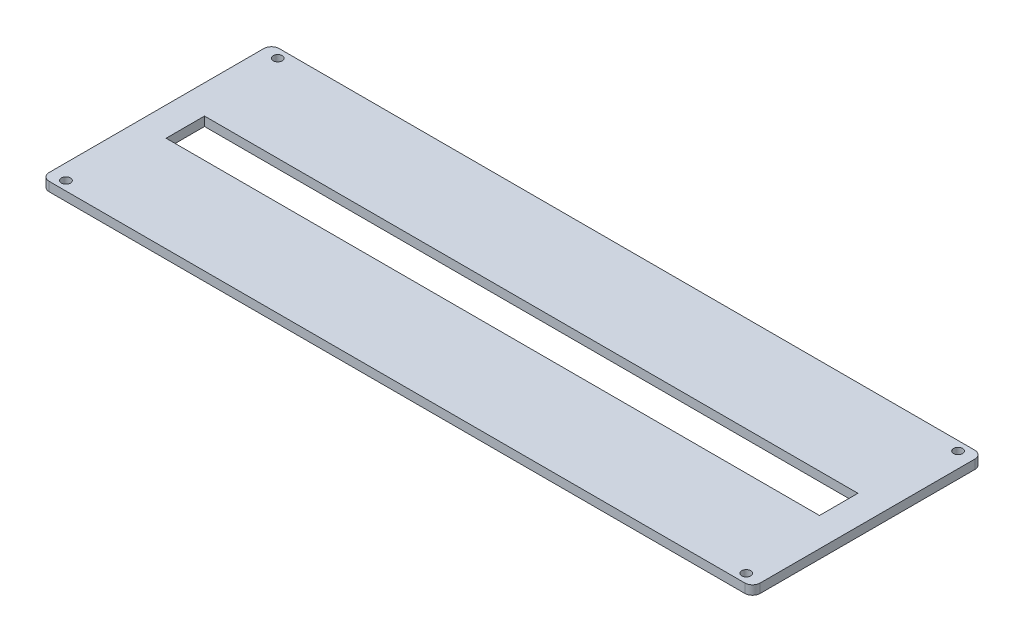
ISO-10303-21;
HEADER;
FILE_DESCRIPTION(('STEP AP214'),'2;1');
FILE_NAME('part.step','',(''),(''),'','','');
FILE_SCHEMA(('AUTOMOTIVE_DESIGN { 1 0 10303 214 1 1 1 1 }'));
ENDSEC;
DATA;
#1=APPLICATION_CONTEXT('core data for automotive mechanical design processes');
#2=APPLICATION_PROTOCOL_DEFINITION('international standard','automotive_design',2000,#1);
#3=PRODUCT_CONTEXT('',#1,'mechanical');
#4=PRODUCT('Part','Part','',(#3));
#5=PRODUCT_RELATED_PRODUCT_CATEGORY('part','',(#4));
#6=PRODUCT_DEFINITION_FORMATION('','',#4);
#7=PRODUCT_DEFINITION_CONTEXT('part definition',#1,'design');
#8=PRODUCT_DEFINITION('design','',#6,#7);
#9=PRODUCT_DEFINITION_SHAPE('','',#8);
#10=(LENGTH_UNIT() NAMED_UNIT(*) SI_UNIT(.MILLI.,.METRE.));
#11=(NAMED_UNIT(*) PLANE_ANGLE_UNIT() SI_UNIT($,.RADIAN.));
#12=(NAMED_UNIT(*) SI_UNIT($,.STERADIAN.) SOLID_ANGLE_UNIT());
#13=UNCERTAINTY_MEASURE_WITH_UNIT(LENGTH_MEASURE(1.E-05),#10,'distance_accuracy_value','');
#14=(GEOMETRIC_REPRESENTATION_CONTEXT(3) GLOBAL_UNCERTAINTY_ASSIGNED_CONTEXT((#13)) GLOBAL_UNIT_ASSIGNED_CONTEXT((#10,
#11,#12)) REPRESENTATION_CONTEXT('',''));
#15=CARTESIAN_POINT('',(0.,0.,0.));
#16=DIRECTION('',(0.,0.,1.));
#17=DIRECTION('',(1.,0.,0.));
#18=AXIS2_PLACEMENT_3D('',#15,#16,#17);
#19=CARTESIAN_POINT('',(0.,3.,0.));
#20=DIRECTION('',(0.,1.,0.));
#21=DIRECTION('',(0.,0.,1.));
#22=AXIS2_PLACEMENT_3D('',#19,#20,#21);
#23=PLANE('',#22);
#24=CARTESIAN_POINT('',(-5.08,3.,73.));
#25=DIRECTION('',(0.,1.,0.));
#26=DIRECTION('',(0.,0.,1.));
#27=AXIS2_PLACEMENT_3D('',#24,#25,#26);
#28=CIRCLE('',#27,1.5);
#29=CARTESIAN_POINT('',(-5.08,3.,74.5));
#30=VERTEX_POINT('',#29);
#31=EDGE_CURVE('E162',#30,#30,#28,.F.);
#32=ORIENTED_EDGE('',*,*,#31,.T.);
#33=EDGE_LOOP('',(#32));
#34=FACE_BOUND('',#33,.T.);
#35=CARTESIAN_POINT('',(-5.08,3.,3.00000000000004));
#36=DIRECTION('',(0.,1.,0.));
#37=DIRECTION('',(0.,0.,1.));
#38=AXIS2_PLACEMENT_3D('',#35,#36,#37);
#39=CIRCLE('',#38,1.5);
#40=CARTESIAN_POINT('',(-5.08,3.,4.50000000000004));
#41=VERTEX_POINT('',#40);
#42=EDGE_CURVE('E165',#41,#41,#39,.T.);
#43=ORIENTED_EDGE('',*,*,#42,.F.);
#44=EDGE_LOOP('',(#43));
#45=FACE_BOUND('',#44,.T.);
#46=DIRECTION('',(-1.,0.,0.));
#47=VECTOR('',#46,1.);
#48=CARTESIAN_POINT('',(0.,3.,76.));
#49=LINE('',#48,#47);
#50=CARTESIAN_POINT('',(-2.54,3.,76.));
#51=VERTEX_POINT('',#50);
#52=CARTESIAN_POINT('',(-232.41,3.,76.));
#53=VERTEX_POINT('',#52);
#54=EDGE_CURVE('E172',#51,#53,#49,.T.);
#55=ORIENTED_EDGE('',*,*,#54,.F.);
#56=CARTESIAN_POINT('',(-2.54,3.,73.46));
#57=DIRECTION('',(0.,1.,0.));
#58=DIRECTION('',(0.,0.,1.));
#59=AXIS2_PLACEMENT_3D('',#56,#57,#58);
#60=CIRCLE('',#59,2.54);
#61=CARTESIAN_POINT('',(0.,3.,73.46));
#62=VERTEX_POINT('',#61);
#63=EDGE_CURVE('E238',#51,#62,#60,.T.);
#64=ORIENTED_EDGE('',*,*,#63,.T.);
#65=DIRECTION('',(0.,0.,-1.));
#66=VECTOR('',#65,1.);
#67=CARTESIAN_POINT('',(0.,3.,0.));
#68=LINE('',#67,#66);
#69=CARTESIAN_POINT('',(0.,3.,2.54));
#70=VERTEX_POINT('',#69);
#71=EDGE_CURVE('E175',#62,#70,#68,.T.);
#72=ORIENTED_EDGE('',*,*,#71,.T.);
#73=CARTESIAN_POINT('',(-2.54,3.,2.54));
#74=DIRECTION('',(0.,1.,0.));
#75=DIRECTION('',(0.,0.,1.));
#76=AXIS2_PLACEMENT_3D('',#73,#74,#75);
#77=CIRCLE('',#76,2.54);
#78=CARTESIAN_POINT('',(-2.54,3.,0.));
#79=VERTEX_POINT('',#78);
#80=EDGE_CURVE('E59',#70,#79,#77,.T.);
#81=ORIENTED_EDGE('',*,*,#80,.T.);
#82=DIRECTION('',(-1.,0.,0.));
#83=VECTOR('',#82,1.);
#84=CARTESIAN_POINT('',(0.,3.,0.));
#85=LINE('',#84,#83);
#86=CARTESIAN_POINT('',(-232.41,3.,0.));
#87=VERTEX_POINT('',#86);
#88=EDGE_CURVE('E177',#79,#87,#85,.T.);
#89=ORIENTED_EDGE('',*,*,#88,.T.);
#90=CARTESIAN_POINT('',(-232.41,3.,2.54000000000001));
#91=DIRECTION('',(0.,1.,0.));
#92=DIRECTION('',(0.,0.,1.));
#93=AXIS2_PLACEMENT_3D('',#90,#91,#92);
#94=CIRCLE('',#93,2.54);
#95=CARTESIAN_POINT('',(-234.95,3.,2.54000000000001));
#96=VERTEX_POINT('',#95);
#97=EDGE_CURVE('E235',#87,#96,#94,.T.);
#98=ORIENTED_EDGE('',*,*,#97,.T.);
#99=DIRECTION('',(0.,0.,-1.));
#100=VECTOR('',#99,1.);
#101=CARTESIAN_POINT('',(-234.95,3.,0.));
#102=LINE('',#101,#100);
#103=CARTESIAN_POINT('',(-234.95,3.,73.46));
#104=VERTEX_POINT('',#103);
#105=EDGE_CURVE('E169',#104,#96,#102,.T.);
#106=ORIENTED_EDGE('',*,*,#105,.F.);
#107=CARTESIAN_POINT('',(-232.41,3.,73.46));
#108=DIRECTION('',(0.,1.,0.));
#109=DIRECTION('',(0.,0.,1.));
#110=AXIS2_PLACEMENT_3D('',#107,#108,#109);
#111=CIRCLE('',#110,2.54);
#112=EDGE_CURVE('E233',#104,#53,#111,.T.);
#113=ORIENTED_EDGE('',*,*,#112,.T.);
#114=EDGE_LOOP('',(#55,#64,#72,#81,#89,#98,#106,#113));
#115=FACE_BOUND('',#114,.T.);
#116=CARTESIAN_POINT('',(-229.87,3.,73.));
#117=DIRECTION('',(0.,1.,0.));
#118=DIRECTION('',(0.,0.,1.));
#119=AXIS2_PLACEMENT_3D('',#116,#117,#118);
#120=CIRCLE('',#119,1.5);
#121=CARTESIAN_POINT('',(-229.87,3.,74.5));
#122=VERTEX_POINT('',#121);
#123=EDGE_CURVE('E179',#122,#122,#120,.T.);
#124=ORIENTED_EDGE('',*,*,#123,.F.);
#125=EDGE_LOOP('',(#124));
#126=FACE_BOUND('',#125,.T.);
#127=CARTESIAN_POINT('',(-229.87,3.,3.00000000000004));
#128=DIRECTION('',(0.,1.,0.));
#129=DIRECTION('',(0.,0.,1.));
#130=AXIS2_PLACEMENT_3D('',#127,#128,#129);
#131=CIRCLE('',#130,1.5);
#132=CARTESIAN_POINT('',(-229.87,3.,4.50000000000004));
#133=VERTEX_POINT('',#132);
#134=EDGE_CURVE('E182',#133,#133,#131,.F.);
#135=ORIENTED_EDGE('',*,*,#134,.T.);
#136=EDGE_LOOP('',(#135));
#137=FACE_BOUND('',#136,.T.);
#138=DIRECTION('',(-1.,0.,0.));
#139=VECTOR('',#138,1.);
#140=CARTESIAN_POINT('',(-9.52500000000001,3.,31.65));
#141=LINE('',#140,#139);
#142=CARTESIAN_POINT('',(-9.52500000000001,3.,31.65));
#143=VERTEX_POINT('',#142);
#144=CARTESIAN_POINT('',(-225.425,3.,31.65));
#145=VERTEX_POINT('',#144);
#146=EDGE_CURVE('E152',#143,#145,#141,.T.);
#147=ORIENTED_EDGE('',*,*,#146,.F.);
#148=DIRECTION('',(0.,0.,1.));
#149=VECTOR('',#148,1.);
#150=CARTESIAN_POINT('',(-9.52500000000001,3.,31.65));
#151=LINE('',#150,#149);
#152=CARTESIAN_POINT('',(-9.52500000000001,3.,44.35));
#153=VERTEX_POINT('',#152);
#154=EDGE_CURVE('E132',#143,#153,#151,.T.);
#155=ORIENTED_EDGE('',*,*,#154,.T.);
#156=DIRECTION('',(-1.,0.,0.));
#157=VECTOR('',#156,1.);
#158=CARTESIAN_POINT('',(-9.52500000000001,3.,44.35));
#159=LINE('',#158,#157);
#160=CARTESIAN_POINT('',(-225.425,3.,44.35));
#161=VERTEX_POINT('',#160);
#162=EDGE_CURVE('E142',#153,#161,#159,.T.);
#163=ORIENTED_EDGE('',*,*,#162,.T.);
#164=DIRECTION('',(0.,0.,1.));
#165=VECTOR('',#164,1.);
#166=CARTESIAN_POINT('',(-225.425,3.,31.65));
#167=LINE('',#166,#165);
#168=EDGE_CURVE('E148',#145,#161,#167,.T.);
#169=ORIENTED_EDGE('',*,*,#168,.F.);
#170=EDGE_LOOP('',(#147,#155,#163,#169));
#171=FACE_BOUND('',#170,.T.);
#172=ADVANCED_FACE('F37',(#34,#45,#115,#126,#137,#171),#23,.T.);
#173=CARTESIAN_POINT('',(0.,0.,0.));
#174=DIRECTION('',(0.,1.,0.));
#175=DIRECTION('',(0.,0.,1.));
#176=AXIS2_PLACEMENT_3D('',#173,#174,#175);
#177=PLANE('',#176);
#178=CARTESIAN_POINT('',(-229.87,0.,3.00000000000004));
#179=DIRECTION('',(0.,1.,0.));
#180=DIRECTION('',(0.,0.,1.));
#181=AXIS2_PLACEMENT_3D('',#178,#179,#180);
#182=CIRCLE('',#181,1.5);
#183=CARTESIAN_POINT('',(-229.87,0.,4.50000000000004));
#184=VERTEX_POINT('',#183);
#185=EDGE_CURVE('E166',#184,#184,#182,.F.);
#186=ORIENTED_EDGE('',*,*,#185,.F.);
#187=EDGE_LOOP('',(#186));
#188=FACE_BOUND('',#187,.T.);
#189=CARTESIAN_POINT('',(-229.87,0.,73.));
#190=DIRECTION('',(0.,1.,0.));
#191=DIRECTION('',(0.,0.,1.));
#192=AXIS2_PLACEMENT_3D('',#189,#190,#191);
#193=CIRCLE('',#192,1.5);
#194=CARTESIAN_POINT('',(-229.87,0.,74.5));
#195=VERTEX_POINT('',#194);
#196=EDGE_CURVE('E202',#195,#195,#193,.T.);
#197=ORIENTED_EDGE('',*,*,#196,.T.);
#198=EDGE_LOOP('',(#197));
#199=FACE_BOUND('',#198,.T.);
#200=DIRECTION('',(0.,0.,-1.));
#201=VECTOR('',#200,1.);
#202=CARTESIAN_POINT('',(0.,0.,0.));
#203=LINE('',#202,#201);
#204=CARTESIAN_POINT('',(0.,0.,73.46));
#205=VERTEX_POINT('',#204);
#206=CARTESIAN_POINT('',(0.,0.,2.54));
#207=VERTEX_POINT('',#206);
#208=EDGE_CURVE('E197',#205,#207,#203,.T.);
#209=ORIENTED_EDGE('',*,*,#208,.F.);
#210=CARTESIAN_POINT('',(-2.54,0.,73.46));
#211=DIRECTION('',(0.,1.,0.));
#212=DIRECTION('',(0.,0.,1.));
#213=AXIS2_PLACEMENT_3D('',#210,#211,#212);
#214=CIRCLE('',#213,2.54);
#215=CARTESIAN_POINT('',(-2.54,0.,76.));
#216=VERTEX_POINT('',#215);
#217=EDGE_CURVE('E226',#205,#216,#214,.F.);
#218=ORIENTED_EDGE('',*,*,#217,.T.);
#219=DIRECTION('',(-1.,0.,0.));
#220=VECTOR('',#219,1.);
#221=CARTESIAN_POINT('',(0.,0.,76.));
#222=LINE('',#221,#220);
#223=CARTESIAN_POINT('',(-232.41,0.,76.));
#224=VERTEX_POINT('',#223);
#225=EDGE_CURVE('E194',#216,#224,#222,.T.);
#226=ORIENTED_EDGE('',*,*,#225,.T.);
#227=CARTESIAN_POINT('',(-232.41,0.,73.46));
#228=DIRECTION('',(0.,1.,0.));
#229=DIRECTION('',(0.,0.,1.));
#230=AXIS2_PLACEMENT_3D('',#227,#228,#229);
#231=CIRCLE('',#230,2.54);
#232=CARTESIAN_POINT('',(-234.95,0.,73.46));
#233=VERTEX_POINT('',#232);
#234=EDGE_CURVE('E220',#224,#233,#231,.F.);
#235=ORIENTED_EDGE('',*,*,#234,.T.);
#236=DIRECTION('',(0.,0.,-1.));
#237=VECTOR('',#236,1.);
#238=CARTESIAN_POINT('',(-234.95,0.,0.));
#239=LINE('',#238,#237);
#240=CARTESIAN_POINT('',(-234.95,0.,2.54000000000001));
#241=VERTEX_POINT('',#240);
#242=EDGE_CURVE('E191',#233,#241,#239,.T.);
#243=ORIENTED_EDGE('',*,*,#242,.T.);
#244=CARTESIAN_POINT('',(-232.41,0.,2.54000000000001));
#245=DIRECTION('',(0.,1.,0.));
#246=DIRECTION('',(0.,0.,1.));
#247=AXIS2_PLACEMENT_3D('',#244,#245,#246);
#248=CIRCLE('',#247,2.54);
#249=CARTESIAN_POINT('',(-232.41,0.,0.));
#250=VERTEX_POINT('',#249);
#251=EDGE_CURVE('E222',#241,#250,#248,.F.);
#252=ORIENTED_EDGE('',*,*,#251,.T.);
#253=DIRECTION('',(-1.,0.,0.));
#254=VECTOR('',#253,1.);
#255=CARTESIAN_POINT('',(0.,0.,0.));
#256=LINE('',#255,#254);
#257=CARTESIAN_POINT('',(-2.54,0.,0.));
#258=VERTEX_POINT('',#257);
#259=EDGE_CURVE('E200',#258,#250,#256,.T.);
#260=ORIENTED_EDGE('',*,*,#259,.F.);
#261=CARTESIAN_POINT('',(-2.54,0.,2.54));
#262=DIRECTION('',(0.,1.,0.));
#263=DIRECTION('',(0.,0.,1.));
#264=AXIS2_PLACEMENT_3D('',#261,#262,#263);
#265=CIRCLE('',#264,2.54);
#266=EDGE_CURVE('E224',#258,#207,#265,.F.);
#267=ORIENTED_EDGE('',*,*,#266,.T.);
#268=EDGE_LOOP('',(#209,#218,#226,#235,#243,#252,#260,#267));
#269=FACE_BOUND('',#268,.T.);
#270=CARTESIAN_POINT('',(-5.08,0.,3.00000000000004));
#271=DIRECTION('',(0.,1.,0.));
#272=DIRECTION('',(0.,0.,1.));
#273=AXIS2_PLACEMENT_3D('',#270,#271,#272);
#274=CIRCLE('',#273,1.5);
#275=CARTESIAN_POINT('',(-5.08,0.,4.50000000000004));
#276=VERTEX_POINT('',#275);
#277=EDGE_CURVE('E188',#276,#276,#274,.T.);
#278=ORIENTED_EDGE('',*,*,#277,.T.);
#279=EDGE_LOOP('',(#278));
#280=FACE_BOUND('',#279,.T.);
#281=CARTESIAN_POINT('',(-5.08,0.,73.));
#282=DIRECTION('',(0.,1.,0.));
#283=DIRECTION('',(0.,0.,1.));
#284=AXIS2_PLACEMENT_3D('',#281,#282,#283);
#285=CIRCLE('',#284,1.5);
#286=CARTESIAN_POINT('',(-5.08,0.,74.5));
#287=VERTEX_POINT('',#286);
#288=EDGE_CURVE('E138',#287,#287,#285,.F.);
#289=ORIENTED_EDGE('',*,*,#288,.F.);
#290=EDGE_LOOP('',(#289));
#291=FACE_BOUND('',#290,.T.);
#292=DIRECTION('',(0.,0.,1.));
#293=VECTOR('',#292,1.);
#294=CARTESIAN_POINT('',(-9.52500000000001,0.,0.));
#295=LINE('',#294,#293);
#296=CARTESIAN_POINT('',(-9.52500000000001,0.,31.65));
#297=VERTEX_POINT('',#296);
#298=CARTESIAN_POINT('',(-9.52500000000001,0.,44.35));
#299=VERTEX_POINT('',#298);
#300=EDGE_CURVE('E135',#297,#299,#295,.T.);
#301=ORIENTED_EDGE('',*,*,#300,.F.);
#302=DIRECTION('',(-1.,0.,0.));
#303=VECTOR('',#302,1.);
#304=CARTESIAN_POINT('',(0.,0.,31.65));
#305=LINE('',#304,#303);
#306=CARTESIAN_POINT('',(-225.425,0.,31.65));
#307=VERTEX_POINT('',#306);
#308=EDGE_CURVE('E185',#297,#307,#305,.T.);
#309=ORIENTED_EDGE('',*,*,#308,.T.);
#310=DIRECTION('',(0.,0.,1.));
#311=VECTOR('',#310,1.);
#312=CARTESIAN_POINT('',(-225.425,0.,0.));
#313=LINE('',#312,#311);
#314=CARTESIAN_POINT('',(-225.425,0.,44.35));
#315=VERTEX_POINT('',#314);
#316=EDGE_CURVE('E209',#307,#315,#313,.T.);
#317=ORIENTED_EDGE('',*,*,#316,.T.);
#318=DIRECTION('',(-1.,0.,0.));
#319=VECTOR('',#318,1.);
#320=CARTESIAN_POINT('',(0.,0.,44.35));
#321=LINE('',#320,#319);
#322=EDGE_CURVE('E212',#299,#315,#321,.T.);
#323=ORIENTED_EDGE('',*,*,#322,.F.);
#324=EDGE_LOOP('',(#301,#309,#317,#323));
#325=FACE_BOUND('',#324,.T.);
#326=ADVANCED_FACE('F261',(#188,#199,#269,#280,#291,#325),#177,.F.);
#327=CARTESIAN_POINT('',(-234.95,3.,0.));
#328=DIRECTION('',(-1.,0.,0.));
#329=DIRECTION('',(0.,0.,1.));
#330=AXIS2_PLACEMENT_3D('',#327,#328,#329);
#331=PLANE('',#330);
#332=ORIENTED_EDGE('',*,*,#105,.T.);
#333=DIRECTION('',(0.,-1.,0.));
#334=VECTOR('',#333,1.);
#335=CARTESIAN_POINT('',(-234.95,0.,2.54000000000001));
#336=LINE('',#335,#334);
#337=EDGE_CURVE('E11',#96,#241,#336,.T.);
#338=ORIENTED_EDGE('',*,*,#337,.T.);
#339=ORIENTED_EDGE('',*,*,#242,.F.);
#340=DIRECTION('',(0.,-1.,0.));
#341=VECTOR('',#340,1.);
#342=CARTESIAN_POINT('',(-234.95,3.,73.46));
#343=LINE('',#342,#341);
#344=EDGE_CURVE('E45',#233,#104,#343,.F.);
#345=ORIENTED_EDGE('',*,*,#344,.T.);
#346=EDGE_LOOP('',(#332,#338,#339,#345));
#347=FACE_BOUND('',#346,.T.);
#348=ADVANCED_FACE('F247',(#347),#331,.T.);
#349=CARTESIAN_POINT('',(0.,3.,76.));
#350=DIRECTION('',(0.,0.,1.));
#351=DIRECTION('',(1.,0.,0.));
#352=AXIS2_PLACEMENT_3D('',#349,#350,#351);
#353=PLANE('',#352);
#354=ORIENTED_EDGE('',*,*,#225,.F.);
#355=DIRECTION('',(0.,-1.,0.));
#356=VECTOR('',#355,1.);
#357=CARTESIAN_POINT('',(-2.54,3.,76.));
#358=LINE('',#357,#356);
#359=EDGE_CURVE('E231',#216,#51,#358,.F.);
#360=ORIENTED_EDGE('',*,*,#359,.T.);
#361=ORIENTED_EDGE('',*,*,#54,.T.);
#362=DIRECTION('',(0.,-1.,0.));
#363=VECTOR('',#362,1.);
#364=CARTESIAN_POINT('',(-232.41,3.,76.));
#365=LINE('',#364,#363);
#366=EDGE_CURVE('E228',#53,#224,#365,.T.);
#367=ORIENTED_EDGE('',*,*,#366,.T.);
#368=EDGE_LOOP('',(#354,#360,#361,#367));
#369=FACE_BOUND('',#368,.T.);
#370=ADVANCED_FACE('F257',(#369),#353,.T.);
#371=CARTESIAN_POINT('',(0.,3.,0.));
#372=DIRECTION('',(-1.,0.,0.));
#373=DIRECTION('',(0.,0.,1.));
#374=AXIS2_PLACEMENT_3D('',#371,#372,#373);
#375=PLANE('',#374);
#376=ORIENTED_EDGE('',*,*,#71,.F.);
#377=DIRECTION('',(0.,-1.,0.));
#378=VECTOR('',#377,1.);
#379=CARTESIAN_POINT('',(0.,0.,73.46));
#380=LINE('',#379,#378);
#381=EDGE_CURVE('E217',#62,#205,#380,.T.);
#382=ORIENTED_EDGE('',*,*,#381,.T.);
#383=ORIENTED_EDGE('',*,*,#208,.T.);
#384=DIRECTION('',(0.,-1.,0.));
#385=VECTOR('',#384,1.);
#386=CARTESIAN_POINT('',(0.,3.,2.54));
#387=LINE('',#386,#385);
#388=EDGE_CURVE('E215',#207,#70,#387,.F.);
#389=ORIENTED_EDGE('',*,*,#388,.T.);
#390=EDGE_LOOP('',(#376,#382,#383,#389));
#391=FACE_BOUND('',#390,.T.);
#392=ADVANCED_FACE('F269',(#391),#375,.F.);
#393=CARTESIAN_POINT('',(-229.87,3.,73.));
#394=DIRECTION('',(0.,-1.,0.));
#395=DIRECTION('',(0.,0.,-1.));
#396=AXIS2_PLACEMENT_3D('',#393,#394,#395);
#397=CYLINDRICAL_SURFACE('',#396,1.5);
#398=ORIENTED_EDGE('',*,*,#123,.T.);
#399=EDGE_LOOP('',(#398));
#400=FACE_BOUND('',#399,.T.);
#401=ORIENTED_EDGE('',*,*,#196,.F.);
#402=EDGE_LOOP('',(#401));
#403=FACE_BOUND('',#402,.T.);
#404=ADVANCED_FACE('F301',(#400,#403),#397,.F.);
#405=CARTESIAN_POINT('',(0.,3.,0.));
#406=DIRECTION('',(0.,0.,1.));
#407=DIRECTION('',(1.,0.,0.));
#408=AXIS2_PLACEMENT_3D('',#405,#406,#407);
#409=PLANE('',#408);
#410=ORIENTED_EDGE('',*,*,#88,.F.);
#411=DIRECTION('',(0.,-1.,0.));
#412=VECTOR('',#411,1.);
#413=CARTESIAN_POINT('',(-2.54,3.,0.));
#414=LINE('',#413,#412);
#415=EDGE_CURVE('E241',#79,#258,#414,.T.);
#416=ORIENTED_EDGE('',*,*,#415,.T.);
#417=ORIENTED_EDGE('',*,*,#259,.T.);
#418=DIRECTION('',(0.,-1.,0.));
#419=VECTOR('',#418,1.);
#420=CARTESIAN_POINT('',(-232.41,3.,0.));
#421=LINE('',#420,#419);
#422=EDGE_CURVE('E52',#250,#87,#421,.F.);
#423=ORIENTED_EDGE('',*,*,#422,.T.);
#424=EDGE_LOOP('',(#410,#416,#417,#423));
#425=FACE_BOUND('',#424,.T.);
#426=ADVANCED_FACE('F275',(#425),#409,.F.);
#427=CARTESIAN_POINT('',(-5.08,3.,3.00000000000004));
#428=DIRECTION('',(0.,-1.,0.));
#429=DIRECTION('',(0.,0.,-1.));
#430=AXIS2_PLACEMENT_3D('',#427,#428,#429);
#431=CYLINDRICAL_SURFACE('',#430,1.5);
#432=ORIENTED_EDGE('',*,*,#42,.T.);
#433=EDGE_LOOP('',(#432));
#434=FACE_BOUND('',#433,.T.);
#435=ORIENTED_EDGE('',*,*,#277,.F.);
#436=EDGE_LOOP('',(#435));
#437=FACE_BOUND('',#436,.T.);
#438=ADVANCED_FACE('F307',(#434,#437),#431,.F.);
#439=CARTESIAN_POINT('',(-5.08,3.,73.));
#440=DIRECTION('',(0.,-1.,0.));
#441=DIRECTION('',(0.,0.,-1.));
#442=AXIS2_PLACEMENT_3D('',#439,#440,#441);
#443=CYLINDRICAL_SURFACE('',#442,1.5);
#444=ORIENTED_EDGE('',*,*,#31,.F.);
#445=EDGE_LOOP('',(#444));
#446=FACE_BOUND('',#445,.T.);
#447=ORIENTED_EDGE('',*,*,#288,.T.);
#448=EDGE_LOOP('',(#447));
#449=FACE_BOUND('',#448,.T.);
#450=ADVANCED_FACE('F299',(#446,#449),#443,.F.);
#451=CARTESIAN_POINT('',(-229.87,3.,3.00000000000004));
#452=DIRECTION('',(0.,-1.,0.));
#453=DIRECTION('',(0.,0.,-1.));
#454=AXIS2_PLACEMENT_3D('',#451,#452,#453);
#455=CYLINDRICAL_SURFACE('',#454,1.5);
#456=ORIENTED_EDGE('',*,*,#134,.F.);
#457=EDGE_LOOP('',(#456));
#458=FACE_BOUND('',#457,.T.);
#459=ORIENTED_EDGE('',*,*,#185,.T.);
#460=EDGE_LOOP('',(#459));
#461=FACE_BOUND('',#460,.T.);
#462=ADVANCED_FACE('F296',(#458,#461),#455,.F.);
#463=CARTESIAN_POINT('',(-9.52500000000001,-0.809999999999999,31.65));
#464=DIRECTION('',(-1.,0.,0.));
#465=DIRECTION('',(0.,0.,1.));
#466=AXIS2_PLACEMENT_3D('',#463,#464,#465);
#467=PLANE('',#466);
#468=ORIENTED_EDGE('',*,*,#300,.T.);
#469=DIRECTION('',(0.,1.,0.));
#470=VECTOR('',#469,1.);
#471=CARTESIAN_POINT('',(-9.52500000000001,-0.809999999999999,44.35));
#472=LINE('',#471,#470);
#473=EDGE_CURVE('E127',#299,#153,#472,.T.);
#474=ORIENTED_EDGE('',*,*,#473,.T.);
#475=ORIENTED_EDGE('',*,*,#154,.F.);
#476=DIRECTION('',(0.,1.,0.));
#477=VECTOR('',#476,1.);
#478=CARTESIAN_POINT('',(-9.52500000000001,-0.809999999999999,31.65));
#479=LINE('',#478,#477);
#480=EDGE_CURVE('E157',#297,#143,#479,.T.);
#481=ORIENTED_EDGE('',*,*,#480,.F.);
#482=EDGE_LOOP('',(#468,#474,#475,#481));
#483=FACE_BOUND('',#482,.T.);
#484=ADVANCED_FACE('F129',(#483),#467,.T.);
#485=CARTESIAN_POINT('',(-9.52500000000001,-0.809999999999999,44.35));
#486=DIRECTION('',(0.,0.,-1.));
#487=DIRECTION('',(-1.,0.,0.));
#488=AXIS2_PLACEMENT_3D('',#485,#486,#487);
#489=PLANE('',#488);
#490=ORIENTED_EDGE('',*,*,#322,.T.);
#491=DIRECTION('',(0.,1.,0.));
#492=VECTOR('',#491,1.);
#493=CARTESIAN_POINT('',(-225.425,-0.809999999999999,44.35));
#494=LINE('',#493,#492);
#495=EDGE_CURVE('E139',#315,#161,#494,.T.);
#496=ORIENTED_EDGE('',*,*,#495,.T.);
#497=ORIENTED_EDGE('',*,*,#162,.F.);
#498=ORIENTED_EDGE('',*,*,#473,.F.);
#499=EDGE_LOOP('',(#490,#496,#497,#498));
#500=FACE_BOUND('',#499,.T.);
#501=ADVANCED_FACE('F143',(#500),#489,.T.);
#502=CARTESIAN_POINT('',(-225.425,-0.809999999999999,31.65));
#503=DIRECTION('',(-1.,0.,0.));
#504=DIRECTION('',(0.,0.,1.));
#505=AXIS2_PLACEMENT_3D('',#502,#503,#504);
#506=PLANE('',#505);
#507=DIRECTION('',(0.,1.,0.));
#508=VECTOR('',#507,1.);
#509=CARTESIAN_POINT('',(-225.425,-0.809999999999999,31.65));
#510=LINE('',#509,#508);
#511=EDGE_CURVE('E159',#307,#145,#510,.T.);
#512=ORIENTED_EDGE('',*,*,#511,.T.);
#513=ORIENTED_EDGE('',*,*,#168,.T.);
#514=ORIENTED_EDGE('',*,*,#495,.F.);
#515=ORIENTED_EDGE('',*,*,#316,.F.);
#516=EDGE_LOOP('',(#512,#513,#514,#515));
#517=FACE_BOUND('',#516,.T.);
#518=ADVANCED_FACE('F325',(#517),#506,.F.);
#519=CARTESIAN_POINT('',(-9.52500000000001,-0.809999999999999,31.65));
#520=DIRECTION('',(0.,0.,-1.));
#521=DIRECTION('',(-1.,0.,0.));
#522=AXIS2_PLACEMENT_3D('',#519,#520,#521);
#523=PLANE('',#522);
#524=ORIENTED_EDGE('',*,*,#480,.T.);
#525=ORIENTED_EDGE('',*,*,#146,.T.);
#526=ORIENTED_EDGE('',*,*,#511,.F.);
#527=ORIENTED_EDGE('',*,*,#308,.F.);
#528=EDGE_LOOP('',(#524,#525,#526,#527));
#529=FACE_BOUND('',#528,.T.);
#530=ADVANCED_FACE('F321',(#529),#523,.F.);
#531=CARTESIAN_POINT('',(-2.54,3.,73.46));
#532=DIRECTION('',(0.,1.,0.));
#533=DIRECTION('',(0.,0.,1.));
#534=AXIS2_PLACEMENT_3D('',#531,#532,#533);
#535=CYLINDRICAL_SURFACE('',#534,2.54);
#536=ORIENTED_EDGE('',*,*,#63,.F.);
#537=ORIENTED_EDGE('',*,*,#359,.F.);
#538=ORIENTED_EDGE('',*,*,#217,.F.);
#539=ORIENTED_EDGE('',*,*,#381,.F.);
#540=EDGE_LOOP('',(#536,#537,#538,#539));
#541=FACE_BOUND('',#540,.T.);
#542=ADVANCED_FACE('F266',(#541),#535,.T.);
#543=CARTESIAN_POINT('',(-2.54,3.,2.54));
#544=DIRECTION('',(0.,-1.,0.));
#545=DIRECTION('',(0.,0.,-1.));
#546=AXIS2_PLACEMENT_3D('',#543,#544,#545);
#547=CYLINDRICAL_SURFACE('',#546,2.54);
#548=ORIENTED_EDGE('',*,*,#80,.F.);
#549=ORIENTED_EDGE('',*,*,#388,.F.);
#550=ORIENTED_EDGE('',*,*,#266,.F.);
#551=ORIENTED_EDGE('',*,*,#415,.F.);
#552=EDGE_LOOP('',(#548,#549,#550,#551));
#553=FACE_BOUND('',#552,.T.);
#554=ADVANCED_FACE('F273',(#553),#547,.T.);
#555=CARTESIAN_POINT('',(-232.41,3.,2.54000000000001));
#556=DIRECTION('',(0.,1.,0.));
#557=DIRECTION('',(0.,0.,1.));
#558=AXIS2_PLACEMENT_3D('',#555,#556,#557);
#559=CYLINDRICAL_SURFACE('',#558,2.54);
#560=ORIENTED_EDGE('',*,*,#97,.F.);
#561=ORIENTED_EDGE('',*,*,#422,.F.);
#562=ORIENTED_EDGE('',*,*,#251,.F.);
#563=ORIENTED_EDGE('',*,*,#337,.F.);
#564=EDGE_LOOP('',(#560,#561,#562,#563));
#565=FACE_BOUND('',#564,.T.);
#566=ADVANCED_FACE('F277',(#565),#559,.T.);
#567=CARTESIAN_POINT('',(-232.41,3.,73.46));
#568=DIRECTION('',(0.,-1.,0.));
#569=DIRECTION('',(0.,0.,-1.));
#570=AXIS2_PLACEMENT_3D('',#567,#568,#569);
#571=CYLINDRICAL_SURFACE('',#570,2.54);
#572=ORIENTED_EDGE('',*,*,#112,.F.);
#573=ORIENTED_EDGE('',*,*,#344,.F.);
#574=ORIENTED_EDGE('',*,*,#234,.F.);
#575=ORIENTED_EDGE('',*,*,#366,.F.);
#576=EDGE_LOOP('',(#572,#573,#574,#575));
#577=FACE_BOUND('',#576,.T.);
#578=ADVANCED_FACE('F39',(#577),#571,.T.);
#579=CLOSED_SHELL('',(#172,#326,#348,#370,#392,#404,#426,#438,#450,#462,#484,#501,#518,#530,
#542,#554,#566,#578));
#580=MANIFOLD_SOLID_BREP('B2',#579);
#581=ADVANCED_BREP_SHAPE_REPRESENTATION('',(#18,#580),#14);
#582=SHAPE_DEFINITION_REPRESENTATION(#9,#581);
ENDSEC;
END-ISO-10303-21;
